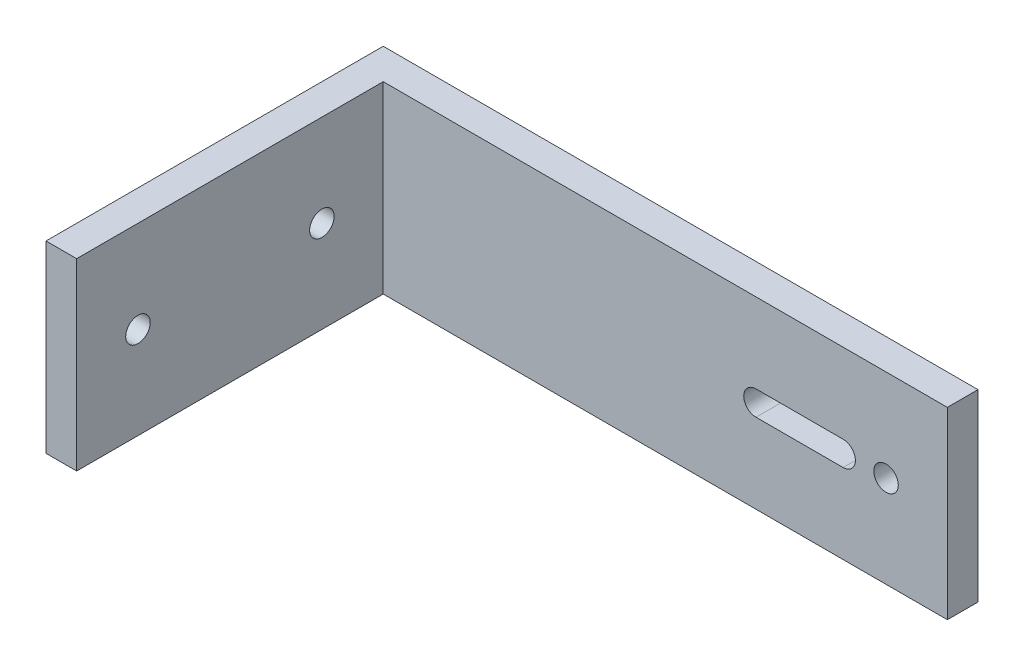
ISO-10303-21;
HEADER;
FILE_DESCRIPTION(('STEP AP214'),'2;1');
FILE_NAME('part.step','',(''),(''),'','','');
FILE_SCHEMA(('AUTOMOTIVE_DESIGN { 1 0 10303 214 1 1 1 1 }'));
ENDSEC;
DATA;
#1=APPLICATION_CONTEXT('core data for automotive mechanical design processes');
#2=APPLICATION_PROTOCOL_DEFINITION('international standard','automotive_design',2000,#1);
#3=PRODUCT_CONTEXT('',#1,'mechanical');
#4=PRODUCT('Part','Part','',(#3));
#5=PRODUCT_RELATED_PRODUCT_CATEGORY('part','',(#4));
#6=PRODUCT_DEFINITION_FORMATION('','',#4);
#7=PRODUCT_DEFINITION_CONTEXT('part definition',#1,'design');
#8=PRODUCT_DEFINITION('design','',#6,#7);
#9=PRODUCT_DEFINITION_SHAPE('','',#8);
#10=(LENGTH_UNIT() NAMED_UNIT(*) SI_UNIT(.MILLI.,.METRE.));
#11=(NAMED_UNIT(*) PLANE_ANGLE_UNIT() SI_UNIT($,.RADIAN.));
#12=(NAMED_UNIT(*) SI_UNIT($,.STERADIAN.) SOLID_ANGLE_UNIT());
#13=UNCERTAINTY_MEASURE_WITH_UNIT(LENGTH_MEASURE(1.E-05),#10,'distance_accuracy_value','');
#14=(GEOMETRIC_REPRESENTATION_CONTEXT(3) GLOBAL_UNCERTAINTY_ASSIGNED_CONTEXT((#13)) GLOBAL_UNIT_ASSIGNED_CONTEXT((#10,
#11,#12)) REPRESENTATION_CONTEXT('',''));
#15=CARTESIAN_POINT('',(0.,0.,0.));
#16=DIRECTION('',(0.,0.,1.));
#17=DIRECTION('',(1.,0.,0.));
#18=AXIS2_PLACEMENT_3D('',#15,#16,#17);
#19=CARTESIAN_POINT('',(48.5,15.,5.));
#20=DIRECTION('',(-1.,0.,0.));
#21=DIRECTION('',(0.,0.,1.));
#22=AXIS2_PLACEMENT_3D('',#19,#20,#21);
#23=PLANE('',#22);
#24=DIRECTION('',(0.,1.,0.));
#25=VECTOR('',#24,1.);
#26=CARTESIAN_POINT('',(48.5,15.,0.));
#27=LINE('',#26,#25);
#28=CARTESIAN_POINT('',(48.5,-15.,0.));
#29=VERTEX_POINT('',#28);
#30=CARTESIAN_POINT('',(48.5,15.,0.));
#31=VERTEX_POINT('',#30);
#32=EDGE_CURVE('E152',#29,#31,#27,.T.);
#33=ORIENTED_EDGE('',*,*,#32,.T.);
#34=DIRECTION('',(0.,0.,-1.));
#35=VECTOR('',#34,1.);
#36=CARTESIAN_POINT('',(48.5,15.,5.));
#37=LINE('',#36,#35);
#38=CARTESIAN_POINT('',(48.5,15.,5.));
#39=VERTEX_POINT('',#38);
#40=EDGE_CURVE('E11',#39,#31,#37,.T.);
#41=ORIENTED_EDGE('',*,*,#40,.F.);
#42=DIRECTION('',(0.,1.,0.));
#43=VECTOR('',#42,1.);
#44=CARTESIAN_POINT('',(48.5,15.,5.));
#45=LINE('',#44,#43);
#46=CARTESIAN_POINT('',(48.5,-15.,5.));
#47=VERTEX_POINT('',#46);
#48=EDGE_CURVE('E186',#47,#39,#45,.T.);
#49=ORIENTED_EDGE('',*,*,#48,.F.);
#50=DIRECTION('',(0.,0.,-1.));
#51=VECTOR('',#50,1.);
#52=CARTESIAN_POINT('',(48.5,-15.,5.));
#53=LINE('',#52,#51);
#54=EDGE_CURVE('E122',#47,#29,#53,.T.);
#55=ORIENTED_EDGE('',*,*,#54,.T.);
#56=EDGE_LOOP('',(#33,#41,#49,#55));
#57=FACE_BOUND('',#56,.T.);
#58=ADVANCED_FACE('F34',(#57),#23,.F.);
#59=CARTESIAN_POINT('',(-48.5,15.,5.));
#60=DIRECTION('',(0.,-1.,0.));
#61=DIRECTION('',(0.,0.,-1.));
#62=AXIS2_PLACEMENT_3D('',#59,#60,#61);
#63=PLANE('',#62);
#64=DIRECTION('',(-1.,0.,0.));
#65=VECTOR('',#64,1.);
#66=CARTESIAN_POINT('',(-48.5,15.,0.));
#67=LINE('',#66,#65);
#68=CARTESIAN_POINT('',(-48.5,15.,0.));
#69=VERTEX_POINT('',#68);
#70=EDGE_CURVE('E196',#31,#69,#67,.T.);
#71=ORIENTED_EDGE('',*,*,#70,.T.);
#72=DIRECTION('',(0.,0.,-1.));
#73=VECTOR('',#72,1.);
#74=CARTESIAN_POINT('',(-48.5,15.,5.));
#75=LINE('',#74,#73);
#76=CARTESIAN_POINT('',(-48.5,15.,55.));
#77=VERTEX_POINT('',#76);
#78=EDGE_CURVE('E42',#77,#69,#75,.T.);
#79=ORIENTED_EDGE('',*,*,#78,.F.);
#80=DIRECTION('',(-1.,0.,0.));
#81=VECTOR('',#80,1.);
#82=CARTESIAN_POINT('',(-48.5,15.,55.));
#83=LINE('',#82,#81);
#84=CARTESIAN_POINT('',(-43.5,15.,55.));
#85=VERTEX_POINT('',#84);
#86=EDGE_CURVE('E136',#85,#77,#83,.T.);
#87=ORIENTED_EDGE('',*,*,#86,.F.);
#88=DIRECTION('',(0.,0.,-1.));
#89=VECTOR('',#88,1.);
#90=CARTESIAN_POINT('',(-43.5,15.,55.));
#91=LINE('',#90,#89);
#92=CARTESIAN_POINT('',(-43.5,15.,5.));
#93=VERTEX_POINT('',#92);
#94=EDGE_CURVE('E144',#85,#93,#91,.T.);
#95=ORIENTED_EDGE('',*,*,#94,.T.);
#96=DIRECTION('',(-1.,0.,0.));
#97=VECTOR('',#96,1.);
#98=CARTESIAN_POINT('',(-48.5,15.,5.));
#99=LINE('',#98,#97);
#100=EDGE_CURVE('E189',#39,#93,#99,.T.);
#101=ORIENTED_EDGE('',*,*,#100,.F.);
#102=ORIENTED_EDGE('',*,*,#40,.T.);
#103=EDGE_LOOP('',(#71,#79,#87,#95,#101,#102));
#104=FACE_BOUND('',#103,.T.);
#105=ADVANCED_FACE('F218',(#104),#63,.F.);
#106=CARTESIAN_POINT('',(-48.5,15.,5.));
#107=DIRECTION('',(1.,0.,0.));
#108=DIRECTION('',(0.,1.,0.));
#109=AXIS2_PLACEMENT_3D('',#106,#107,#108);
#110=PLANE('',#109);
#111=CARTESIAN_POINT('',(-48.5,0.,15.));
#112=DIRECTION('',(-1.,0.,0.));
#113=DIRECTION('',(0.,-1.,0.));
#114=AXIS2_PLACEMENT_3D('',#111,#112,#113);
#115=CIRCLE('',#114,2.);
#116=CARTESIAN_POINT('',(-48.5,-2.00000000000002,15.));
#117=VERTEX_POINT('',#116);
#118=EDGE_CURVE('E204',#117,#117,#115,.T.);
#119=ORIENTED_EDGE('',*,*,#118,.F.);
#120=EDGE_LOOP('',(#119));
#121=FACE_BOUND('',#120,.T.);
#122=CARTESIAN_POINT('',(-48.5,0.,45.));
#123=DIRECTION('',(-1.,0.,0.));
#124=DIRECTION('',(0.,-1.,0.));
#125=AXIS2_PLACEMENT_3D('',#122,#123,#124);
#126=CIRCLE('',#125,2.);
#127=CARTESIAN_POINT('',(-48.5,-2.00000000000003,45.));
#128=VERTEX_POINT('',#127);
#129=EDGE_CURVE('E140',#128,#128,#126,.T.);
#130=ORIENTED_EDGE('',*,*,#129,.F.);
#131=EDGE_LOOP('',(#130));
#132=FACE_BOUND('',#131,.T.);
#133=DIRECTION('',(0.,-1.,0.));
#134=VECTOR('',#133,1.);
#135=CARTESIAN_POINT('',(-48.5,15.,0.));
#136=LINE('',#135,#134);
#137=CARTESIAN_POINT('',(-48.5,-15.,0.));
#138=VERTEX_POINT('',#137);
#139=EDGE_CURVE('E119',#69,#138,#136,.T.);
#140=ORIENTED_EDGE('',*,*,#139,.T.);
#141=DIRECTION('',(0.,0.,-1.));
#142=VECTOR('',#141,1.);
#143=CARTESIAN_POINT('',(-48.5,-15.,5.));
#144=LINE('',#143,#142);
#145=CARTESIAN_POINT('',(-48.5,-15.,55.));
#146=VERTEX_POINT('',#145);
#147=EDGE_CURVE('E112',#146,#138,#144,.T.);
#148=ORIENTED_EDGE('',*,*,#147,.F.);
#149=DIRECTION('',(0.,-1.,0.));
#150=VECTOR('',#149,1.);
#151=CARTESIAN_POINT('',(-48.5,15.,55.));
#152=LINE('',#151,#150);
#153=EDGE_CURVE('E117',#77,#146,#152,.T.);
#154=ORIENTED_EDGE('',*,*,#153,.F.);
#155=ORIENTED_EDGE('',*,*,#78,.T.);
#156=EDGE_LOOP('',(#140,#148,#154,#155));
#157=FACE_BOUND('',#156,.T.);
#158=ADVANCED_FACE('F114',(#121,#132,#157),#110,.F.);
#159=CARTESIAN_POINT('',(-48.5,-15.,5.));
#160=DIRECTION('',(0.,1.,0.));
#161=DIRECTION('',(0.,0.,1.));
#162=AXIS2_PLACEMENT_3D('',#159,#160,#161);
#163=PLANE('',#162);
#164=DIRECTION('',(1.,0.,0.));
#165=VECTOR('',#164,1.);
#166=CARTESIAN_POINT('',(-48.5,-15.,0.));
#167=LINE('',#166,#165);
#168=EDGE_CURVE('E190',#138,#29,#167,.T.);
#169=ORIENTED_EDGE('',*,*,#168,.T.);
#170=ORIENTED_EDGE('',*,*,#54,.F.);
#171=DIRECTION('',(1.,0.,0.));
#172=VECTOR('',#171,1.);
#173=CARTESIAN_POINT('',(-48.5,-15.,5.));
#174=LINE('',#173,#172);
#175=CARTESIAN_POINT('',(-43.5,-15.,5.));
#176=VERTEX_POINT('',#175);
#177=EDGE_CURVE('E192',#176,#47,#174,.T.);
#178=ORIENTED_EDGE('',*,*,#177,.F.);
#179=DIRECTION('',(0.,0.,-1.));
#180=VECTOR('',#179,1.);
#181=CARTESIAN_POINT('',(-43.5,-15.,55.));
#182=LINE('',#181,#180);
#183=CARTESIAN_POINT('',(-43.5,-15.,55.));
#184=VERTEX_POINT('',#183);
#185=EDGE_CURVE('E128',#184,#176,#182,.T.);
#186=ORIENTED_EDGE('',*,*,#185,.F.);
#187=DIRECTION('',(1.,0.,0.));
#188=VECTOR('',#187,1.);
#189=CARTESIAN_POINT('',(-48.5,-15.,55.));
#190=LINE('',#189,#188);
#191=EDGE_CURVE('E125',#146,#184,#190,.T.);
#192=ORIENTED_EDGE('',*,*,#191,.F.);
#193=ORIENTED_EDGE('',*,*,#147,.T.);
#194=EDGE_LOOP('',(#169,#170,#178,#186,#192,#193));
#195=FACE_BOUND('',#194,.T.);
#196=ADVANCED_FACE('F126',(#195),#163,.F.);
#197=CARTESIAN_POINT('',(0.,0.,5.));
#198=DIRECTION('',(0.,0.,1.));
#199=DIRECTION('',(1.,0.,0.));
#200=AXIS2_PLACEMENT_3D('',#197,#198,#199);
#201=PLANE('',#200);
#202=DIRECTION('',(0.,1.,0.));
#203=VECTOR('',#202,1.);
#204=CARTESIAN_POINT('',(-43.5,15.,5.));
#205=LINE('',#204,#203);
#206=EDGE_CURVE('E50',#176,#93,#205,.T.);
#207=ORIENTED_EDGE('',*,*,#206,.F.);
#208=ORIENTED_EDGE('',*,*,#177,.T.);
#209=ORIENTED_EDGE('',*,*,#48,.T.);
#210=ORIENTED_EDGE('',*,*,#100,.T.);
#211=EDGE_LOOP('',(#207,#208,#209,#210));
#212=FACE_BOUND('',#211,.T.);
#213=CARTESIAN_POINT('',(38.5,0.,5.));
#214=DIRECTION('',(0.,0.,1.));
#215=DIRECTION('',(1.,0.,0.));
#216=AXIS2_PLACEMENT_3D('',#213,#214,#215);
#217=CIRCLE('',#216,2.);
#218=CARTESIAN_POINT('',(40.5,0.,5.));
#219=VERTEX_POINT('',#218);
#220=EDGE_CURVE('E153',#219,#219,#217,.T.);
#221=ORIENTED_EDGE('',*,*,#220,.F.);
#222=EDGE_LOOP('',(#221));
#223=FACE_BOUND('',#222,.T.);
#224=CARTESIAN_POINT('',(17.2922067582703,0.,5.));
#225=DIRECTION('',(0.,0.,1.));
#226=DIRECTION('',(1.,0.,0.));
#227=AXIS2_PLACEMENT_3D('',#224,#225,#226);
#228=CIRCLE('',#227,2.);
#229=CARTESIAN_POINT('',(17.2922067582703,2.,5.));
#230=VERTEX_POINT('',#229);
#231=CARTESIAN_POINT('',(17.2922067582703,-2.,5.));
#232=VERTEX_POINT('',#231);
#233=EDGE_CURVE('E58',#230,#232,#228,.T.);
#234=ORIENTED_EDGE('',*,*,#233,.F.);
#235=DIRECTION('',(-1.,0.,0.));
#236=VECTOR('',#235,1.);
#237=CARTESIAN_POINT('',(17.2922067582703,2.,5.));
#238=LINE('',#237,#236);
#239=CARTESIAN_POINT('',(31.5,2.,5.));
#240=VERTEX_POINT('',#239);
#241=EDGE_CURVE('E161',#240,#230,#238,.T.);
#242=ORIENTED_EDGE('',*,*,#241,.F.);
#243=CARTESIAN_POINT('',(31.5,0.,5.));
#244=DIRECTION('',(0.,0.,1.));
#245=DIRECTION('',(1.,0.,0.));
#246=AXIS2_PLACEMENT_3D('',#243,#244,#245);
#247=CIRCLE('',#246,2.);
#248=CARTESIAN_POINT('',(31.5,-2.,5.));
#249=VERTEX_POINT('',#248);
#250=EDGE_CURVE('E175',#249,#240,#247,.T.);
#251=ORIENTED_EDGE('',*,*,#250,.F.);
#252=DIRECTION('',(1.,0.,0.));
#253=VECTOR('',#252,1.);
#254=CARTESIAN_POINT('',(17.2922067582703,-2.,5.));
#255=LINE('',#254,#253);
#256=EDGE_CURVE('E172',#232,#249,#255,.T.);
#257=ORIENTED_EDGE('',*,*,#256,.F.);
#258=EDGE_LOOP('',(#234,#242,#251,#257));
#259=FACE_BOUND('',#258,.T.);
#260=ADVANCED_FACE('F225',(#212,#223,#259),#201,.T.);
#261=CARTESIAN_POINT('',(0.,0.,0.));
#262=DIRECTION('',(0.,0.,1.));
#263=DIRECTION('',(1.,0.,0.));
#264=AXIS2_PLACEMENT_3D('',#261,#262,#263);
#265=PLANE('',#264);
#266=CARTESIAN_POINT('',(38.5,0.,0.));
#267=DIRECTION('',(0.,0.,1.));
#268=DIRECTION('',(1.,0.,0.));
#269=AXIS2_PLACEMENT_3D('',#266,#267,#268);
#270=CIRCLE('',#269,2.);
#271=CARTESIAN_POINT('',(40.5,0.,0.));
#272=VERTEX_POINT('',#271);
#273=EDGE_CURVE('E149',#272,#272,#270,.T.);
#274=ORIENTED_EDGE('',*,*,#273,.T.);
#275=EDGE_LOOP('',(#274));
#276=FACE_BOUND('',#275,.T.);
#277=DIRECTION('',(-1.,0.,0.));
#278=VECTOR('',#277,1.);
#279=CARTESIAN_POINT('',(17.2922067582703,2.,0.));
#280=LINE('',#279,#278);
#281=CARTESIAN_POINT('',(31.5,2.,0.));
#282=VERTEX_POINT('',#281);
#283=CARTESIAN_POINT('',(17.2922067582703,2.,0.));
#284=VERTEX_POINT('',#283);
#285=EDGE_CURVE('E167',#282,#284,#280,.T.);
#286=ORIENTED_EDGE('',*,*,#285,.T.);
#287=CARTESIAN_POINT('',(17.2922067582703,0.,0.));
#288=DIRECTION('',(0.,0.,1.));
#289=DIRECTION('',(1.,0.,0.));
#290=AXIS2_PLACEMENT_3D('',#287,#288,#289);
#291=CIRCLE('',#290,2.);
#292=CARTESIAN_POINT('',(17.2922067582703,-2.,0.));
#293=VERTEX_POINT('',#292);
#294=EDGE_CURVE('E157',#284,#293,#291,.T.);
#295=ORIENTED_EDGE('',*,*,#294,.T.);
#296=DIRECTION('',(1.,0.,0.));
#297=VECTOR('',#296,1.);
#298=CARTESIAN_POINT('',(17.2922067582703,-2.,0.));
#299=LINE('',#298,#297);
#300=CARTESIAN_POINT('',(31.5,-2.,0.));
#301=VERTEX_POINT('',#300);
#302=EDGE_CURVE('E160',#293,#301,#299,.T.);
#303=ORIENTED_EDGE('',*,*,#302,.T.);
#304=CARTESIAN_POINT('',(31.5,0.,0.));
#305=DIRECTION('',(0.,0.,1.));
#306=DIRECTION('',(1.,0.,0.));
#307=AXIS2_PLACEMENT_3D('',#304,#305,#306);
#308=CIRCLE('',#307,2.);
#309=EDGE_CURVE('E164',#301,#282,#308,.T.);
#310=ORIENTED_EDGE('',*,*,#309,.T.);
#311=EDGE_LOOP('',(#286,#295,#303,#310));
#312=FACE_BOUND('',#311,.T.);
#313=ORIENTED_EDGE('',*,*,#32,.F.);
#314=ORIENTED_EDGE('',*,*,#168,.F.);
#315=ORIENTED_EDGE('',*,*,#139,.F.);
#316=ORIENTED_EDGE('',*,*,#70,.F.);
#317=EDGE_LOOP('',(#313,#314,#315,#316));
#318=FACE_BOUND('',#317,.T.);
#319=ADVANCED_FACE('F237',(#276,#312,#318),#265,.F.);
#320=CARTESIAN_POINT('',(17.2922067582703,0.,0.));
#321=DIRECTION('',(0.,0.,1.));
#322=DIRECTION('',(1.,0.,0.));
#323=AXIS2_PLACEMENT_3D('',#320,#321,#322);
#324=CYLINDRICAL_SURFACE('',#323,2.);
#325=ORIENTED_EDGE('',*,*,#233,.T.);
#326=DIRECTION('',(0.,0.,1.));
#327=VECTOR('',#326,1.);
#328=CARTESIAN_POINT('',(17.2922067582703,-2.,0.));
#329=LINE('',#328,#327);
#330=EDGE_CURVE('E170',#293,#232,#329,.T.);
#331=ORIENTED_EDGE('',*,*,#330,.F.);
#332=ORIENTED_EDGE('',*,*,#294,.F.);
#333=DIRECTION('',(0.,0.,1.));
#334=VECTOR('',#333,1.);
#335=CARTESIAN_POINT('',(17.2922067582703,2.,0.));
#336=LINE('',#335,#334);
#337=EDGE_CURVE('E156',#284,#230,#336,.T.);
#338=ORIENTED_EDGE('',*,*,#337,.T.);
#339=EDGE_LOOP('',(#325,#331,#332,#338));
#340=FACE_BOUND('',#339,.T.);
#341=ADVANCED_FACE('F260',(#340),#324,.F.);
#342=CARTESIAN_POINT('',(17.2922067582703,2.,0.));
#343=DIRECTION('',(0.,1.,0.));
#344=DIRECTION('',(0.,0.,1.));
#345=AXIS2_PLACEMENT_3D('',#342,#343,#344);
#346=PLANE('',#345);
#347=ORIENTED_EDGE('',*,*,#241,.T.);
#348=ORIENTED_EDGE('',*,*,#337,.F.);
#349=ORIENTED_EDGE('',*,*,#285,.F.);
#350=DIRECTION('',(0.,0.,1.));
#351=VECTOR('',#350,1.);
#352=CARTESIAN_POINT('',(31.5,2.,0.));
#353=LINE('',#352,#351);
#354=EDGE_CURVE('E181',#282,#240,#353,.T.);
#355=ORIENTED_EDGE('',*,*,#354,.T.);
#356=EDGE_LOOP('',(#347,#348,#349,#355));
#357=FACE_BOUND('',#356,.T.);
#358=ADVANCED_FACE('F256',(#357),#346,.F.);
#359=CARTESIAN_POINT('',(31.5,0.,0.));
#360=DIRECTION('',(0.,0.,1.));
#361=DIRECTION('',(1.,0.,0.));
#362=AXIS2_PLACEMENT_3D('',#359,#360,#361);
#363=CYLINDRICAL_SURFACE('',#362,2.);
#364=ORIENTED_EDGE('',*,*,#250,.T.);
#365=ORIENTED_EDGE('',*,*,#354,.F.);
#366=ORIENTED_EDGE('',*,*,#309,.F.);
#367=DIRECTION('',(0.,0.,1.));
#368=VECTOR('',#367,1.);
#369=CARTESIAN_POINT('',(31.5,-2.,0.));
#370=LINE('',#369,#368);
#371=EDGE_CURVE('E183',#301,#249,#370,.T.);
#372=ORIENTED_EDGE('',*,*,#371,.T.);
#373=EDGE_LOOP('',(#364,#365,#366,#372));
#374=FACE_BOUND('',#373,.T.);
#375=ADVANCED_FACE('F259',(#374),#363,.F.);
#376=CARTESIAN_POINT('',(17.2922067582703,-2.,0.));
#377=DIRECTION('',(0.,-1.,0.));
#378=DIRECTION('',(0.,0.,-1.));
#379=AXIS2_PLACEMENT_3D('',#376,#377,#378);
#380=PLANE('',#379);
#381=ORIENTED_EDGE('',*,*,#256,.T.);
#382=ORIENTED_EDGE('',*,*,#371,.F.);
#383=ORIENTED_EDGE('',*,*,#302,.F.);
#384=ORIENTED_EDGE('',*,*,#330,.T.);
#385=EDGE_LOOP('',(#381,#382,#383,#384));
#386=FACE_BOUND('',#385,.T.);
#387=ADVANCED_FACE('F251',(#386),#380,.F.);
#388=CARTESIAN_POINT('',(38.5,0.,0.));
#389=DIRECTION('',(0.,0.,1.));
#390=DIRECTION('',(1.,0.,0.));
#391=AXIS2_PLACEMENT_3D('',#388,#389,#390);
#392=CYLINDRICAL_SURFACE('',#391,2.);
#393=ORIENTED_EDGE('',*,*,#273,.F.);
#394=EDGE_LOOP('',(#393));
#395=FACE_BOUND('',#394,.T.);
#396=ORIENTED_EDGE('',*,*,#220,.T.);
#397=EDGE_LOOP('',(#396));
#398=FACE_BOUND('',#397,.T.);
#399=ADVANCED_FACE('F243',(#395,#398),#392,.F.);
#400=CARTESIAN_POINT('',(-43.5,15.,55.));
#401=DIRECTION('',(-1.,0.,0.));
#402=DIRECTION('',(0.,0.,1.));
#403=AXIS2_PLACEMENT_3D('',#400,#401,#402);
#404=PLANE('',#403);
#405=CARTESIAN_POINT('',(-43.5,0.,15.));
#406=DIRECTION('',(-1.,0.,0.));
#407=DIRECTION('',(0.,0.,1.));
#408=AXIS2_PLACEMENT_3D('',#405,#406,#407);
#409=CIRCLE('',#408,2.);
#410=CARTESIAN_POINT('',(-43.5,0.,17.));
#411=VERTEX_POINT('',#410);
#412=EDGE_CURVE('E37',#411,#411,#409,.T.);
#413=ORIENTED_EDGE('',*,*,#412,.T.);
#414=EDGE_LOOP('',(#413));
#415=FACE_BOUND('',#414,.T.);
#416=CARTESIAN_POINT('',(-43.5,0.,45.));
#417=DIRECTION('',(-1.,0.,0.));
#418=DIRECTION('',(0.,0.,1.));
#419=AXIS2_PLACEMENT_3D('',#416,#417,#418);
#420=CIRCLE('',#419,2.);
#421=CARTESIAN_POINT('',(-43.5,0.,47.));
#422=VERTEX_POINT('',#421);
#423=EDGE_CURVE('E202',#422,#422,#420,.T.);
#424=ORIENTED_EDGE('',*,*,#423,.T.);
#425=EDGE_LOOP('',(#424));
#426=FACE_BOUND('',#425,.T.);
#427=ORIENTED_EDGE('',*,*,#206,.T.);
#428=ORIENTED_EDGE('',*,*,#94,.F.);
#429=DIRECTION('',(0.,1.,0.));
#430=VECTOR('',#429,1.);
#431=CARTESIAN_POINT('',(-43.5,15.,55.));
#432=LINE('',#431,#430);
#433=EDGE_CURVE('E131',#184,#85,#432,.T.);
#434=ORIENTED_EDGE('',*,*,#433,.F.);
#435=ORIENTED_EDGE('',*,*,#185,.T.);
#436=EDGE_LOOP('',(#427,#428,#434,#435));
#437=FACE_BOUND('',#436,.T.);
#438=ADVANCED_FACE('F241',(#415,#426,#437),#404,.F.);
#439=CARTESIAN_POINT('',(0.,0.,55.));
#440=DIRECTION('',(0.,0.,1.));
#441=DIRECTION('',(1.,0.,0.));
#442=AXIS2_PLACEMENT_3D('',#439,#440,#441);
#443=PLANE('',#442);
#444=ORIENTED_EDGE('',*,*,#153,.T.);
#445=ORIENTED_EDGE('',*,*,#191,.T.);
#446=ORIENTED_EDGE('',*,*,#433,.T.);
#447=ORIENTED_EDGE('',*,*,#86,.T.);
#448=EDGE_LOOP('',(#444,#445,#446,#447));
#449=FACE_BOUND('',#448,.T.);
#450=ADVANCED_FACE('F134',(#449),#443,.T.);
#451=CARTESIAN_POINT('',(48.5,0.,45.));
#452=DIRECTION('',(-1.,0.,0.));
#453=DIRECTION('',(0.,-1.,0.));
#454=AXIS2_PLACEMENT_3D('',#451,#452,#453);
#455=CYLINDRICAL_SURFACE('',#454,2.);
#456=ORIENTED_EDGE('',*,*,#129,.T.);
#457=EDGE_LOOP('',(#456));
#458=FACE_BOUND('',#457,.T.);
#459=ORIENTED_EDGE('',*,*,#423,.F.);
#460=EDGE_LOOP('',(#459));
#461=FACE_BOUND('',#460,.T.);
#462=ADVANCED_FACE('F214',(#458,#461),#455,.F.);
#463=CARTESIAN_POINT('',(48.5,0.,15.));
#464=DIRECTION('',(-1.,0.,0.));
#465=DIRECTION('',(0.,-1.,0.));
#466=AXIS2_PLACEMENT_3D('',#463,#464,#465);
#467=CYLINDRICAL_SURFACE('',#466,2.);
#468=ORIENTED_EDGE('',*,*,#118,.T.);
#469=EDGE_LOOP('',(#468));
#470=FACE_BOUND('',#469,.T.);
#471=ORIENTED_EDGE('',*,*,#412,.F.);
#472=EDGE_LOOP('',(#471));
#473=FACE_BOUND('',#472,.T.);
#474=ADVANCED_FACE('F352',(#470,#473),#467,.F.);
#475=CLOSED_SHELL('',(#58,#105,#158,#196,#260,#319,#341,#358,#375,#387,#399,#438,#450,#462,#474));
#476=MANIFOLD_SOLID_BREP('B2',#475);
#477=ADVANCED_BREP_SHAPE_REPRESENTATION('',(#18,#476),#14);
#478=SHAPE_DEFINITION_REPRESENTATION(#9,#477);
ENDSEC;
END-ISO-10303-21;
